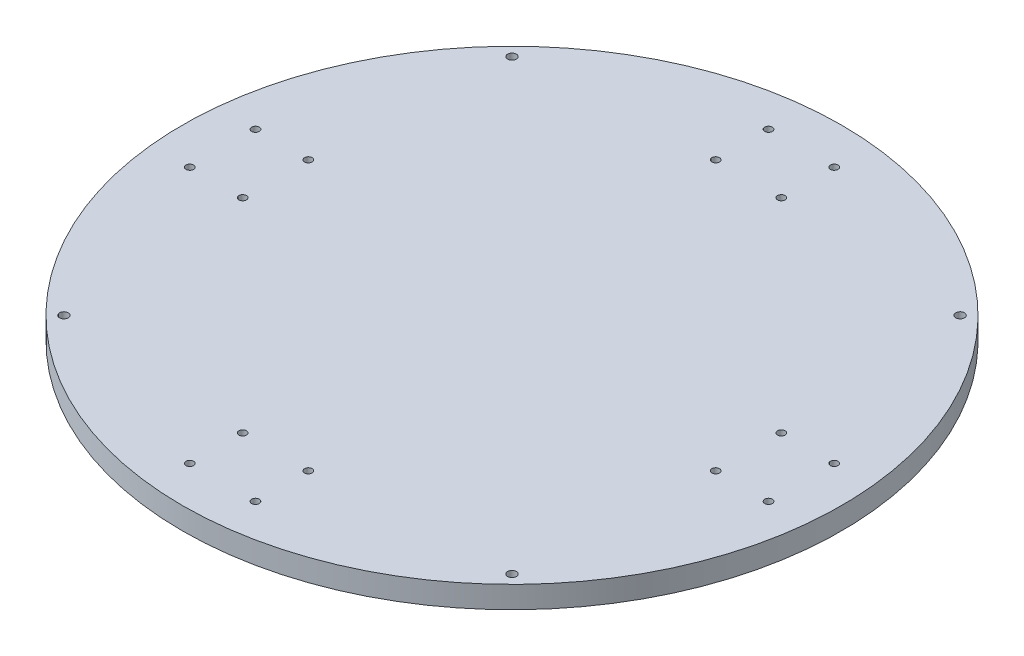
ISO-10303-21;
HEADER;
FILE_DESCRIPTION(('STEP AP214'),'2;1');
FILE_NAME('part.step','',(''),(''),'','','');
FILE_SCHEMA(('AUTOMOTIVE_DESIGN { 1 0 10303 214 1 1 1 1 }'));
ENDSEC;
DATA;
#1=APPLICATION_CONTEXT('core data for automotive mechanical design processes');
#2=APPLICATION_PROTOCOL_DEFINITION('international standard','automotive_design',2000,#1);
#3=PRODUCT_CONTEXT('',#1,'mechanical');
#4=PRODUCT('Part','Part','',(#3));
#5=PRODUCT_RELATED_PRODUCT_CATEGORY('part','',(#4));
#6=PRODUCT_DEFINITION_FORMATION('','',#4);
#7=PRODUCT_DEFINITION_CONTEXT('part definition',#1,'design');
#8=PRODUCT_DEFINITION('design','',#6,#7);
#9=PRODUCT_DEFINITION_SHAPE('','',#8);
#10=(LENGTH_UNIT() NAMED_UNIT(*) SI_UNIT(.MILLI.,.METRE.));
#11=(NAMED_UNIT(*) PLANE_ANGLE_UNIT() SI_UNIT($,.RADIAN.));
#12=(NAMED_UNIT(*) SI_UNIT($,.STERADIAN.) SOLID_ANGLE_UNIT());
#13=UNCERTAINTY_MEASURE_WITH_UNIT(LENGTH_MEASURE(1.E-05),#10,'distance_accuracy_value','');
#14=(GEOMETRIC_REPRESENTATION_CONTEXT(3) GLOBAL_UNCERTAINTY_ASSIGNED_CONTEXT((#13)) GLOBAL_UNIT_ASSIGNED_CONTEXT((#10,
#11,#12)) REPRESENTATION_CONTEXT('',''));
#15=CARTESIAN_POINT('',(0.,0.,0.));
#16=DIRECTION('',(0.,0.,1.));
#17=DIRECTION('',(1.,0.,0.));
#18=AXIS2_PLACEMENT_3D('',#15,#16,#17);
#19=CARTESIAN_POINT('',(0.,10.,0.));
#20=DIRECTION('',(0.,-1.,0.));
#21=DIRECTION('',(0.,0.,-1.));
#22=AXIS2_PLACEMENT_3D('',#19,#20,#21);
#23=CYLINDRICAL_SURFACE('',#22,150.);
#24=CARTESIAN_POINT('',(0.,10.,0.));
#25=DIRECTION('',(0.,1.,0.));
#26=DIRECTION('',(0.,0.,1.));
#27=AXIS2_PLACEMENT_3D('',#24,#25,#26);
#28=CIRCLE('',#27,150.);
#29=CARTESIAN_POINT('',(0.,10.,150.));
#30=VERTEX_POINT('',#29);
#31=EDGE_CURVE('E10',#30,#30,#28,.T.);
#32=ORIENTED_EDGE('',*,*,#31,.F.);
#33=EDGE_LOOP('',(#32));
#34=FACE_BOUND('',#33,.T.);
#35=CARTESIAN_POINT('',(0.,0.,0.));
#36=DIRECTION('',(0.,1.,0.));
#37=DIRECTION('',(0.,0.,1.));
#38=AXIS2_PLACEMENT_3D('',#35,#36,#37);
#39=CIRCLE('',#38,150.);
#40=CARTESIAN_POINT('',(0.,0.,150.));
#41=VERTEX_POINT('',#40);
#42=EDGE_CURVE('E44',#41,#41,#39,.T.);
#43=ORIENTED_EDGE('',*,*,#42,.T.);
#44=EDGE_LOOP('',(#43));
#45=FACE_BOUND('',#44,.T.);
#46=ADVANCED_FACE('F41',(#34,#45),#23,.T.);
#47=CARTESIAN_POINT('',(0.,10.,0.));
#48=DIRECTION('',(0.,1.,0.));
#49=DIRECTION('',(0.,0.,1.));
#50=AXIS2_PLACEMENT_3D('',#47,#48,#49);
#51=PLANE('',#50);
#52=CARTESIAN_POINT('',(-131.706442493367,10.,-14.9449999999864));
#53=DIRECTION('',(0.,1.,0.));
#54=DIRECTION('',(0.,0.,-1.));
#55=AXIS2_PLACEMENT_3D('',#52,#53,#54);
#56=CIRCLE('',#55,1.72999999999047);
#57=CARTESIAN_POINT('',(-131.706442493367,10.,-16.6749999999769));
#58=VERTEX_POINT('',#57);
#59=EDGE_CURVE('E131',#58,#58,#56,.T.);
#60=ORIENTED_EDGE('',*,*,#59,.F.);
#61=EDGE_LOOP('',(#60));
#62=FACE_BOUND('',#61,.T.);
#63=CARTESIAN_POINT('',(-107.646442493367,10.,-14.9449999999864));
#64=DIRECTION('',(0.,1.,0.));
#65=DIRECTION('',(0.,0.,-1.));
#66=AXIS2_PLACEMENT_3D('',#63,#64,#65);
#67=CIRCLE('',#66,1.72999999999054);
#68=CARTESIAN_POINT('',(-107.646442493367,10.,-16.674999999977));
#69=VERTEX_POINT('',#68);
#70=EDGE_CURVE('E140',#69,#69,#67,.T.);
#71=ORIENTED_EDGE('',*,*,#70,.F.);
#72=EDGE_LOOP('',(#71));
#73=FACE_BOUND('',#72,.T.);
#74=CARTESIAN_POINT('',(-107.646442493367,10.,14.9450000000136));
#75=DIRECTION('',(0.,1.,0.));
#76=DIRECTION('',(0.,0.,1.));
#77=AXIS2_PLACEMENT_3D('',#74,#75,#76);
#78=CIRCLE('',#77,1.73000000001802);
#79=CARTESIAN_POINT('',(-107.646442493367,10.,16.6750000000316));
#80=VERTEX_POINT('',#79);
#81=EDGE_CURVE('E148',#80,#80,#78,.T.);
#82=ORIENTED_EDGE('',*,*,#81,.F.);
#83=EDGE_LOOP('',(#82));
#84=FACE_BOUND('',#83,.T.);
#85=CARTESIAN_POINT('',(-131.706442493367,10.,14.9450000000136));
#86=DIRECTION('',(0.,1.,0.));
#87=DIRECTION('',(0.,0.,1.));
#88=AXIS2_PLACEMENT_3D('',#85,#86,#87);
#89=CIRCLE('',#88,1.73000000001826);
#90=CARTESIAN_POINT('',(-131.706442493367,10.,16.6750000000318));
#91=VERTEX_POINT('',#90);
#92=EDGE_CURVE('E156',#91,#91,#89,.T.);
#93=ORIENTED_EDGE('',*,*,#92,.F.);
#94=EDGE_LOOP('',(#93));
#95=FACE_BOUND('',#94,.T.);
#96=CARTESIAN_POINT('',(-14.9449999999731,10.,131.706442493381));
#97=DIRECTION('',(0.,1.,0.));
#98=DIRECTION('',(0.,0.,-1.));
#99=AXIS2_PLACEMENT_3D('',#96,#97,#98);
#100=CIRCLE('',#99,1.72999999997418);
#101=CARTESIAN_POINT('',(-14.9449999999731,10.,129.976442493407));
#102=VERTEX_POINT('',#101);
#103=EDGE_CURVE('E164',#102,#102,#100,.T.);
#104=ORIENTED_EDGE('',*,*,#103,.F.);
#105=EDGE_LOOP('',(#104));
#106=FACE_BOUND('',#105,.T.);
#107=CARTESIAN_POINT('',(-14.9449999999731,10.,107.646442493381));
#108=DIRECTION('',(0.,1.,0.));
#109=DIRECTION('',(0.,0.,-1.));
#110=AXIS2_PLACEMENT_3D('',#107,#108,#109);
#111=CIRCLE('',#110,1.72999999997417);
#112=CARTESIAN_POINT('',(-14.9449999999731,10.,105.916442493407));
#113=VERTEX_POINT('',#112);
#114=EDGE_CURVE('E172',#113,#113,#111,.T.);
#115=ORIENTED_EDGE('',*,*,#114,.F.);
#116=EDGE_LOOP('',(#115));
#117=FACE_BOUND('',#116,.T.);
#118=CARTESIAN_POINT('',(14.9450000000269,10.,107.646442493381));
#119=DIRECTION('',(0.,1.,0.));
#120=DIRECTION('',(0.,0.,1.));
#121=AXIS2_PLACEMENT_3D('',#118,#119,#120);
#122=CIRCLE('',#121,1.73000000002645);
#123=CARTESIAN_POINT('',(14.9450000000269,10.,109.376442493407));
#124=VERTEX_POINT('',#123);
#125=EDGE_CURVE('E180',#124,#124,#122,.T.);
#126=ORIENTED_EDGE('',*,*,#125,.F.);
#127=EDGE_LOOP('',(#126));
#128=FACE_BOUND('',#127,.T.);
#129=CARTESIAN_POINT('',(14.9450000000269,10.,131.706442493381));
#130=DIRECTION('',(0.,1.,0.));
#131=DIRECTION('',(0.,0.,1.));
#132=AXIS2_PLACEMENT_3D('',#129,#130,#131);
#133=CIRCLE('',#132,1.73000000002661);
#134=CARTESIAN_POINT('',(14.9450000000269,10.,133.436442493407));
#135=VERTEX_POINT('',#134);
#136=EDGE_CURVE('E68',#135,#135,#133,.T.);
#137=ORIENTED_EDGE('',*,*,#136,.F.);
#138=EDGE_LOOP('',(#137));
#139=FACE_BOUND('',#138,.T.);
#140=CARTESIAN_POINT('',(131.706442493394,10.,14.9449999999866));
#141=DIRECTION('',(0.,1.,0.));
#142=DIRECTION('',(0.,0.,-1.));
#143=AXIS2_PLACEMENT_3D('',#140,#141,#142);
#144=CIRCLE('',#143,1.7299999999837);
#145=CARTESIAN_POINT('',(131.706442493394,10.,13.2150000000029));
#146=VERTEX_POINT('',#145);
#147=EDGE_CURVE('E67',#146,#146,#144,.T.);
#148=ORIENTED_EDGE('',*,*,#147,.F.);
#149=EDGE_LOOP('',(#148));
#150=FACE_BOUND('',#149,.T.);
#151=CARTESIAN_POINT('',(107.646442493394,10.,14.9449999999866));
#152=DIRECTION('',(0.,1.,0.));
#153=DIRECTION('',(0.,0.,-1.));
#154=AXIS2_PLACEMENT_3D('',#151,#152,#153);
#155=CIRCLE('',#154,1.72999999998362);
#156=CARTESIAN_POINT('',(107.646442493394,10.,13.215000000003));
#157=VERTEX_POINT('',#156);
#158=EDGE_CURVE('E76',#157,#157,#155,.T.);
#159=ORIENTED_EDGE('',*,*,#158,.F.);
#160=EDGE_LOOP('',(#159));
#161=FACE_BOUND('',#160,.T.);
#162=CARTESIAN_POINT('',(107.646442493394,10.,-14.9450000000134));
#163=DIRECTION('',(0.,1.,0.));
#164=DIRECTION('',(0.,0.,1.));
#165=AXIS2_PLACEMENT_3D('',#162,#163,#164);
#166=CIRCLE('',#165,1.73000000000919);
#167=CARTESIAN_POINT('',(107.646442493394,10.,-13.2150000000042));
#168=VERTEX_POINT('',#167);
#169=EDGE_CURVE('E84',#168,#168,#166,.T.);
#170=ORIENTED_EDGE('',*,*,#169,.F.);
#171=EDGE_LOOP('',(#170));
#172=FACE_BOUND('',#171,.T.);
#173=CARTESIAN_POINT('',(131.706442493394,10.,-14.9450000000134));
#174=DIRECTION('',(0.,1.,0.));
#175=DIRECTION('',(0.,0.,1.));
#176=AXIS2_PLACEMENT_3D('',#173,#174,#175);
#177=CIRCLE('',#176,1.73000000000928);
#178=CARTESIAN_POINT('',(131.706442493394,10.,-13.2150000000041));
#179=VERTEX_POINT('',#178);
#180=EDGE_CURVE('E92',#179,#179,#177,.T.);
#181=ORIENTED_EDGE('',*,*,#180,.F.);
#182=EDGE_LOOP('',(#181));
#183=FACE_BOUND('',#182,.T.);
#184=CARTESIAN_POINT('',(-14.945,10.,-107.646442493381));
#185=DIRECTION('',(0.,1.,0.));
#186=DIRECTION('',(0.,0.,1.));
#187=AXIS2_PLACEMENT_3D('',#184,#185,#186);
#188=CIRCLE('',#187,1.73);
#189=CARTESIAN_POINT('',(-14.945,10.,-105.916442493381));
#190=VERTEX_POINT('',#189);
#191=EDGE_CURVE('E59',#190,#190,#188,.T.);
#192=ORIENTED_EDGE('',*,*,#191,.F.);
#193=EDGE_LOOP('',(#192));
#194=FACE_BOUND('',#193,.T.);
#195=CARTESIAN_POINT('',(14.9449999999993,10.,-107.646442493381));
#196=DIRECTION('',(0.,1.,0.));
#197=DIRECTION('',(0.,0.,-1.));
#198=AXIS2_PLACEMENT_3D('',#195,#196,#197);
#199=CIRCLE('',#198,1.73);
#200=CARTESIAN_POINT('',(14.9449999999993,10.,-109.376442493381));
#201=VERTEX_POINT('',#200);
#202=EDGE_CURVE('E101',#201,#201,#199,.T.);
#203=ORIENTED_EDGE('',*,*,#202,.F.);
#204=EDGE_LOOP('',(#203));
#205=FACE_BOUND('',#204,.T.);
#206=CARTESIAN_POINT('',(14.9449999999991,10.,-131.706442493381));
#207=DIRECTION('',(0.,1.,0.));
#208=DIRECTION('',(0.,0.,-1.));
#209=AXIS2_PLACEMENT_3D('',#206,#207,#208);
#210=CIRCLE('',#209,1.73000000000001);
#211=CARTESIAN_POINT('',(14.9449999999991,10.,-133.436442493381));
#212=VERTEX_POINT('',#211);
#213=EDGE_CURVE('E102',#212,#212,#210,.T.);
#214=ORIENTED_EDGE('',*,*,#213,.F.);
#215=EDGE_LOOP('',(#214));
#216=FACE_BOUND('',#215,.T.);
#217=CARTESIAN_POINT('',(101.974532959341,10.,-101.974532959341));
#218=DIRECTION('',(0.,1.,0.));
#219=DIRECTION('',(0.,0.,1.));
#220=AXIS2_PLACEMENT_3D('',#217,#218,#219);
#221=CIRCLE('',#220,2.);
#222=CARTESIAN_POINT('',(101.974532959341,10.,-99.9745329593409));
#223=VERTEX_POINT('',#222);
#224=EDGE_CURVE('E116',#223,#223,#221,.T.);
#225=ORIENTED_EDGE('',*,*,#224,.F.);
#226=EDGE_LOOP('',(#225));
#227=FACE_BOUND('',#226,.T.);
#228=CARTESIAN_POINT('',(101.974532959352,10.,101.974532959341));
#229=DIRECTION('',(0.,1.,0.));
#230=DIRECTION('',(0.,0.,1.));
#231=AXIS2_PLACEMENT_3D('',#228,#229,#230);
#232=CIRCLE('',#231,1.99999999999681);
#233=CARTESIAN_POINT('',(101.974532959352,10.,103.974532959338));
#234=VERTEX_POINT('',#233);
#235=EDGE_CURVE('E132',#234,#234,#232,.T.);
#236=ORIENTED_EDGE('',*,*,#235,.F.);
#237=EDGE_LOOP('',(#236));
#238=FACE_BOUND('',#237,.T.);
#239=CARTESIAN_POINT('',(-101.974532959329,10.,101.974532959352));
#240=DIRECTION('',(0.,1.,0.));
#241=DIRECTION('',(0.,0.,1.));
#242=AXIS2_PLACEMENT_3D('',#239,#240,#241);
#243=CIRCLE('',#242,2.00000000000792);
#244=CARTESIAN_POINT('',(-101.974532959329,10.,103.97453295936));
#245=VERTEX_POINT('',#244);
#246=EDGE_CURVE('E203',#245,#245,#243,.T.);
#247=ORIENTED_EDGE('',*,*,#246,.F.);
#248=EDGE_LOOP('',(#247));
#249=FACE_BOUND('',#248,.T.);
#250=CARTESIAN_POINT('',(-101.974532959341,10.,-101.974532959329));
#251=DIRECTION('',(0.,1.,0.));
#252=DIRECTION('',(0.,0.,1.));
#253=AXIS2_PLACEMENT_3D('',#250,#251,#252);
#254=CIRCLE('',#253,2.00000000001144);
#255=CARTESIAN_POINT('',(-101.974532959341,10.,-99.974532959318));
#256=VERTEX_POINT('',#255);
#257=EDGE_CURVE('E195',#256,#256,#254,.T.);
#258=ORIENTED_EDGE('',*,*,#257,.F.);
#259=EDGE_LOOP('',(#258));
#260=FACE_BOUND('',#259,.T.);
#261=CARTESIAN_POINT('',(-14.945,10.,-131.706442493381));
#262=DIRECTION('',(0.,1.,0.));
#263=DIRECTION('',(0.,0.,1.));
#264=AXIS2_PLACEMENT_3D('',#261,#262,#263);
#265=CIRCLE('',#264,1.73);
#266=CARTESIAN_POINT('',(-14.945,10.,-129.97644249338));
#267=VERTEX_POINT('',#266);
#268=EDGE_CURVE('E55',#267,#267,#265,.T.);
#269=ORIENTED_EDGE('',*,*,#268,.F.);
#270=EDGE_LOOP('',(#269));
#271=FACE_BOUND('',#270,.T.);
#272=ORIENTED_EDGE('',*,*,#31,.T.);
#273=EDGE_LOOP('',(#272));
#274=FACE_BOUND('',#273,.T.);
#275=ADVANCED_FACE('F217',(#62,#73,#84,#95,#106,#117,#128,#139,#150,#161,#172,#183,#194,#205,
#216,#227,#238,#249,#260,#271,#274),#51,.T.);
#276=CARTESIAN_POINT('',(0.,0.,0.));
#277=DIRECTION('',(0.,1.,0.));
#278=DIRECTION('',(0.,0.,1.));
#279=AXIS2_PLACEMENT_3D('',#276,#277,#278);
#280=PLANE('',#279);
#281=CARTESIAN_POINT('',(-131.706442493367,0.,-14.9449999999864));
#282=DIRECTION('',(0.,1.,0.));
#283=DIRECTION('',(0.,0.,-1.));
#284=AXIS2_PLACEMENT_3D('',#281,#282,#283);
#285=CIRCLE('',#284,1.72999999999047);
#286=CARTESIAN_POINT('',(-131.706442493367,0.,-16.6749999999769));
#287=VERTEX_POINT('',#286);
#288=EDGE_CURVE('E127',#287,#287,#285,.T.);
#289=ORIENTED_EDGE('',*,*,#288,.T.);
#290=EDGE_LOOP('',(#289));
#291=FACE_BOUND('',#290,.T.);
#292=CARTESIAN_POINT('',(-107.646442493367,0.,-14.9449999999864));
#293=DIRECTION('',(0.,1.,0.));
#294=DIRECTION('',(0.,0.,-1.));
#295=AXIS2_PLACEMENT_3D('',#292,#293,#294);
#296=CIRCLE('',#295,1.72999999999054);
#297=CARTESIAN_POINT('',(-107.646442493367,0.,-16.674999999977));
#298=VERTEX_POINT('',#297);
#299=EDGE_CURVE('E136',#298,#298,#296,.T.);
#300=ORIENTED_EDGE('',*,*,#299,.T.);
#301=EDGE_LOOP('',(#300));
#302=FACE_BOUND('',#301,.T.);
#303=CARTESIAN_POINT('',(-107.646442493367,0.,14.9450000000136));
#304=DIRECTION('',(0.,1.,0.));
#305=DIRECTION('',(0.,0.,1.));
#306=AXIS2_PLACEMENT_3D('',#303,#304,#305);
#307=CIRCLE('',#306,1.73000000001802);
#308=CARTESIAN_POINT('',(-107.646442493367,0.,16.6750000000316));
#309=VERTEX_POINT('',#308);
#310=EDGE_CURVE('E144',#309,#309,#307,.T.);
#311=ORIENTED_EDGE('',*,*,#310,.T.);
#312=EDGE_LOOP('',(#311));
#313=FACE_BOUND('',#312,.T.);
#314=CARTESIAN_POINT('',(-131.706442493367,0.,14.9450000000136));
#315=DIRECTION('',(0.,1.,0.));
#316=DIRECTION('',(0.,0.,1.));
#317=AXIS2_PLACEMENT_3D('',#314,#315,#316);
#318=CIRCLE('',#317,1.73000000001826);
#319=CARTESIAN_POINT('',(-131.706442493367,0.,16.6750000000318));
#320=VERTEX_POINT('',#319);
#321=EDGE_CURVE('E152',#320,#320,#318,.T.);
#322=ORIENTED_EDGE('',*,*,#321,.T.);
#323=EDGE_LOOP('',(#322));
#324=FACE_BOUND('',#323,.T.);
#325=CARTESIAN_POINT('',(-14.9449999999731,0.,131.706442493381));
#326=DIRECTION('',(0.,1.,0.));
#327=DIRECTION('',(0.,0.,-1.));
#328=AXIS2_PLACEMENT_3D('',#325,#326,#327);
#329=CIRCLE('',#328,1.72999999997418);
#330=CARTESIAN_POINT('',(-14.9449999999731,0.,129.976442493407));
#331=VERTEX_POINT('',#330);
#332=EDGE_CURVE('E160',#331,#331,#329,.T.);
#333=ORIENTED_EDGE('',*,*,#332,.T.);
#334=EDGE_LOOP('',(#333));
#335=FACE_BOUND('',#334,.T.);
#336=CARTESIAN_POINT('',(-14.9449999999731,0.,107.646442493381));
#337=DIRECTION('',(0.,1.,0.));
#338=DIRECTION('',(0.,0.,-1.));
#339=AXIS2_PLACEMENT_3D('',#336,#337,#338);
#340=CIRCLE('',#339,1.72999999997417);
#341=CARTESIAN_POINT('',(-14.9449999999731,0.,105.916442493407));
#342=VERTEX_POINT('',#341);
#343=EDGE_CURVE('E168',#342,#342,#340,.T.);
#344=ORIENTED_EDGE('',*,*,#343,.T.);
#345=EDGE_LOOP('',(#344));
#346=FACE_BOUND('',#345,.T.);
#347=CARTESIAN_POINT('',(14.9450000000269,0.,107.646442493381));
#348=DIRECTION('',(0.,1.,0.));
#349=DIRECTION('',(0.,0.,1.));
#350=AXIS2_PLACEMENT_3D('',#347,#348,#349);
#351=CIRCLE('',#350,1.73000000002645);
#352=CARTESIAN_POINT('',(14.9450000000269,0.,109.376442493407));
#353=VERTEX_POINT('',#352);
#354=EDGE_CURVE('E176',#353,#353,#351,.T.);
#355=ORIENTED_EDGE('',*,*,#354,.T.);
#356=EDGE_LOOP('',(#355));
#357=FACE_BOUND('',#356,.T.);
#358=CARTESIAN_POINT('',(14.9450000000269,0.,131.706442493381));
#359=DIRECTION('',(0.,1.,0.));
#360=DIRECTION('',(0.,0.,1.));
#361=AXIS2_PLACEMENT_3D('',#358,#359,#360);
#362=CIRCLE('',#361,1.73000000002661);
#363=CARTESIAN_POINT('',(14.9450000000269,0.,133.436442493407));
#364=VERTEX_POINT('',#363);
#365=EDGE_CURVE('E184',#364,#364,#362,.T.);
#366=ORIENTED_EDGE('',*,*,#365,.T.);
#367=EDGE_LOOP('',(#366));
#368=FACE_BOUND('',#367,.T.);
#369=CARTESIAN_POINT('',(131.706442493394,0.,14.9449999999866));
#370=DIRECTION('',(0.,1.,0.));
#371=DIRECTION('',(0.,0.,-1.));
#372=AXIS2_PLACEMENT_3D('',#369,#370,#371);
#373=CIRCLE('',#372,1.7299999999837);
#374=CARTESIAN_POINT('',(131.706442493394,0.,13.2150000000029));
#375=VERTEX_POINT('',#374);
#376=EDGE_CURVE('E63',#375,#375,#373,.T.);
#377=ORIENTED_EDGE('',*,*,#376,.T.);
#378=EDGE_LOOP('',(#377));
#379=FACE_BOUND('',#378,.T.);
#380=CARTESIAN_POINT('',(107.646442493394,0.,14.9449999999866));
#381=DIRECTION('',(0.,1.,0.));
#382=DIRECTION('',(0.,0.,-1.));
#383=AXIS2_PLACEMENT_3D('',#380,#381,#382);
#384=CIRCLE('',#383,1.72999999998362);
#385=CARTESIAN_POINT('',(107.646442493394,0.,13.215000000003));
#386=VERTEX_POINT('',#385);
#387=EDGE_CURVE('E72',#386,#386,#384,.T.);
#388=ORIENTED_EDGE('',*,*,#387,.T.);
#389=EDGE_LOOP('',(#388));
#390=FACE_BOUND('',#389,.T.);
#391=CARTESIAN_POINT('',(107.646442493394,0.,-14.9450000000134));
#392=DIRECTION('',(0.,1.,0.));
#393=DIRECTION('',(0.,0.,1.));
#394=AXIS2_PLACEMENT_3D('',#391,#392,#393);
#395=CIRCLE('',#394,1.73000000000919);
#396=CARTESIAN_POINT('',(107.646442493394,0.,-13.2150000000042));
#397=VERTEX_POINT('',#396);
#398=EDGE_CURVE('E80',#397,#397,#395,.T.);
#399=ORIENTED_EDGE('',*,*,#398,.T.);
#400=EDGE_LOOP('',(#399));
#401=FACE_BOUND('',#400,.T.);
#402=CARTESIAN_POINT('',(131.706442493394,0.,-14.9450000000134));
#403=DIRECTION('',(0.,1.,0.));
#404=DIRECTION('',(0.,0.,1.));
#405=AXIS2_PLACEMENT_3D('',#402,#403,#404);
#406=CIRCLE('',#405,1.73000000000928);
#407=CARTESIAN_POINT('',(131.706442493394,0.,-13.2150000000041));
#408=VERTEX_POINT('',#407);
#409=EDGE_CURVE('E88',#408,#408,#406,.T.);
#410=ORIENTED_EDGE('',*,*,#409,.T.);
#411=EDGE_LOOP('',(#410));
#412=FACE_BOUND('',#411,.T.);
#413=CARTESIAN_POINT('',(-14.945,0.,-107.646442493381));
#414=DIRECTION('',(0.,1.,0.));
#415=DIRECTION('',(0.,0.,1.));
#416=AXIS2_PLACEMENT_3D('',#413,#414,#415);
#417=CIRCLE('',#416,1.73);
#418=CARTESIAN_POINT('',(-14.945,0.,-105.916442493381));
#419=VERTEX_POINT('',#418);
#420=EDGE_CURVE('E106',#419,#419,#417,.T.);
#421=ORIENTED_EDGE('',*,*,#420,.T.);
#422=EDGE_LOOP('',(#421));
#423=FACE_BOUND('',#422,.T.);
#424=CARTESIAN_POINT('',(14.9449999999993,0.,-107.646442493381));
#425=DIRECTION('',(0.,1.,0.));
#426=DIRECTION('',(0.,0.,-1.));
#427=AXIS2_PLACEMENT_3D('',#424,#425,#426);
#428=CIRCLE('',#427,1.73);
#429=CARTESIAN_POINT('',(14.9449999999993,0.,-109.376442493381));
#430=VERTEX_POINT('',#429);
#431=EDGE_CURVE('E97',#430,#430,#428,.T.);
#432=ORIENTED_EDGE('',*,*,#431,.T.);
#433=EDGE_LOOP('',(#432));
#434=FACE_BOUND('',#433,.T.);
#435=CARTESIAN_POINT('',(14.9449999999991,0.,-131.706442493381));
#436=DIRECTION('',(0.,1.,0.));
#437=DIRECTION('',(0.,0.,-1.));
#438=AXIS2_PLACEMENT_3D('',#435,#436,#437);
#439=CIRCLE('',#438,1.73000000000001);
#440=CARTESIAN_POINT('',(14.9449999999991,0.,-133.436442493381));
#441=VERTEX_POINT('',#440);
#442=EDGE_CURVE('E120',#441,#441,#439,.T.);
#443=ORIENTED_EDGE('',*,*,#442,.T.);
#444=EDGE_LOOP('',(#443));
#445=FACE_BOUND('',#444,.T.);
#446=CARTESIAN_POINT('',(101.974532959341,0.,-101.974532959341));
#447=DIRECTION('',(0.,1.,0.));
#448=DIRECTION('',(0.,0.,1.));
#449=AXIS2_PLACEMENT_3D('',#446,#447,#448);
#450=CIRCLE('',#449,2.);
#451=CARTESIAN_POINT('',(101.974532959341,0.,-99.9745329593409));
#452=VERTEX_POINT('',#451);
#453=EDGE_CURVE('E96',#452,#452,#450,.T.);
#454=ORIENTED_EDGE('',*,*,#453,.T.);
#455=EDGE_LOOP('',(#454));
#456=FACE_BOUND('',#455,.T.);
#457=CARTESIAN_POINT('',(101.974532959352,0.,101.974532959341));
#458=DIRECTION('',(0.,1.,0.));
#459=DIRECTION('',(0.,0.,1.));
#460=AXIS2_PLACEMENT_3D('',#457,#458,#459);
#461=CIRCLE('',#460,1.99999999999681);
#462=CARTESIAN_POINT('',(101.974532959352,0.,103.974532959338));
#463=VERTEX_POINT('',#462);
#464=EDGE_CURVE('E207',#463,#463,#461,.T.);
#465=ORIENTED_EDGE('',*,*,#464,.T.);
#466=EDGE_LOOP('',(#465));
#467=FACE_BOUND('',#466,.T.);
#468=CARTESIAN_POINT('',(-101.974532959329,0.,101.974532959352));
#469=DIRECTION('',(0.,1.,0.));
#470=DIRECTION('',(0.,0.,1.));
#471=AXIS2_PLACEMENT_3D('',#468,#469,#470);
#472=CIRCLE('',#471,2.00000000000792);
#473=CARTESIAN_POINT('',(-101.974532959329,0.,103.97453295936));
#474=VERTEX_POINT('',#473);
#475=EDGE_CURVE('E199',#474,#474,#472,.T.);
#476=ORIENTED_EDGE('',*,*,#475,.T.);
#477=EDGE_LOOP('',(#476));
#478=FACE_BOUND('',#477,.T.);
#479=CARTESIAN_POINT('',(-101.974532959341,0.,-101.974532959329));
#480=DIRECTION('',(0.,1.,0.));
#481=DIRECTION('',(0.,0.,1.));
#482=AXIS2_PLACEMENT_3D('',#479,#480,#481);
#483=CIRCLE('',#482,2.00000000001144);
#484=CARTESIAN_POINT('',(-101.974532959341,0.,-99.974532959318));
#485=VERTEX_POINT('',#484);
#486=EDGE_CURVE('E191',#485,#485,#483,.T.);
#487=ORIENTED_EDGE('',*,*,#486,.T.);
#488=EDGE_LOOP('',(#487));
#489=FACE_BOUND('',#488,.T.);
#490=CARTESIAN_POINT('',(-14.945,0.,-131.706442493381));
#491=DIRECTION('',(0.,1.,0.));
#492=DIRECTION('',(0.,0.,1.));
#493=AXIS2_PLACEMENT_3D('',#490,#491,#492);
#494=CIRCLE('',#493,1.73);
#495=CARTESIAN_POINT('',(-14.945,0.,-129.97644249338));
#496=VERTEX_POINT('',#495);
#497=EDGE_CURVE('E53',#496,#496,#494,.T.);
#498=ORIENTED_EDGE('',*,*,#497,.T.);
#499=EDGE_LOOP('',(#498));
#500=FACE_BOUND('',#499,.T.);
#501=ORIENTED_EDGE('',*,*,#42,.F.);
#502=EDGE_LOOP('',(#501));
#503=FACE_BOUND('',#502,.T.);
#504=ADVANCED_FACE('F220',(#291,#302,#313,#324,#335,#346,#357,#368,#379,#390,#401,#412,#423,
#434,#445,#456,#467,#478,#489,#500,#503),#280,.F.);
#505=CARTESIAN_POINT('',(-14.945,0.,-131.706442493381));
#506=DIRECTION('',(0.,1.,0.));
#507=DIRECTION('',(0.,0.,1.));
#508=AXIS2_PLACEMENT_3D('',#505,#506,#507);
#509=CYLINDRICAL_SURFACE('',#508,1.73);
#510=ORIENTED_EDGE('',*,*,#497,.F.);
#511=EDGE_LOOP('',(#510));
#512=FACE_BOUND('',#511,.T.);
#513=ORIENTED_EDGE('',*,*,#268,.T.);
#514=EDGE_LOOP('',(#513));
#515=FACE_BOUND('',#514,.T.);
#516=ADVANCED_FACE('F229',(#512,#515),#509,.F.);
#517=CARTESIAN_POINT('',(-101.974532959341,0.,-101.974532959329));
#518=DIRECTION('',(0.,1.,0.));
#519=DIRECTION('',(0.,0.,1.));
#520=AXIS2_PLACEMENT_3D('',#517,#518,#519);
#521=CYLINDRICAL_SURFACE('',#520,2.00000000001144);
#522=ORIENTED_EDGE('',*,*,#486,.F.);
#523=EDGE_LOOP('',(#522));
#524=FACE_BOUND('',#523,.T.);
#525=ORIENTED_EDGE('',*,*,#257,.T.);
#526=EDGE_LOOP('',(#525));
#527=FACE_BOUND('',#526,.T.);
#528=ADVANCED_FACE('F231',(#524,#527),#521,.F.);
#529=CARTESIAN_POINT('',(-101.974532959329,0.,101.974532959352));
#530=DIRECTION('',(0.,1.,0.));
#531=DIRECTION('',(0.,0.,1.));
#532=AXIS2_PLACEMENT_3D('',#529,#530,#531);
#533=CYLINDRICAL_SURFACE('',#532,2.00000000000792);
#534=ORIENTED_EDGE('',*,*,#475,.F.);
#535=EDGE_LOOP('',(#534));
#536=FACE_BOUND('',#535,.T.);
#537=ORIENTED_EDGE('',*,*,#246,.T.);
#538=EDGE_LOOP('',(#537));
#539=FACE_BOUND('',#538,.T.);
#540=ADVANCED_FACE('F238',(#536,#539),#533,.F.);
#541=CARTESIAN_POINT('',(101.974532959352,0.,101.974532959341));
#542=DIRECTION('',(0.,1.,0.));
#543=DIRECTION('',(0.,0.,1.));
#544=AXIS2_PLACEMENT_3D('',#541,#542,#543);
#545=CYLINDRICAL_SURFACE('',#544,1.99999999999681);
#546=ORIENTED_EDGE('',*,*,#464,.F.);
#547=EDGE_LOOP('',(#546));
#548=FACE_BOUND('',#547,.T.);
#549=ORIENTED_EDGE('',*,*,#235,.T.);
#550=EDGE_LOOP('',(#549));
#551=FACE_BOUND('',#550,.T.);
#552=ADVANCED_FACE('F215',(#548,#551),#545,.F.);
#553=CARTESIAN_POINT('',(101.974532959341,0.,-101.974532959341));
#554=DIRECTION('',(0.,1.,0.));
#555=DIRECTION('',(0.,0.,1.));
#556=AXIS2_PLACEMENT_3D('',#553,#554,#555);
#557=CYLINDRICAL_SURFACE('',#556,2.);
#558=ORIENTED_EDGE('',*,*,#453,.F.);
#559=EDGE_LOOP('',(#558));
#560=FACE_BOUND('',#559,.T.);
#561=ORIENTED_EDGE('',*,*,#224,.T.);
#562=EDGE_LOOP('',(#561));
#563=FACE_BOUND('',#562,.T.);
#564=ADVANCED_FACE('F291',(#560,#563),#557,.F.);
#565=CARTESIAN_POINT('',(14.9449999999991,0.,-131.706442493381));
#566=DIRECTION('',(0.,1.,0.));
#567=DIRECTION('',(0.,0.,1.));
#568=AXIS2_PLACEMENT_3D('',#565,#566,#567);
#569=CYLINDRICAL_SURFACE('',#568,1.73000000000001);
#570=ORIENTED_EDGE('',*,*,#442,.F.);
#571=EDGE_LOOP('',(#570));
#572=FACE_BOUND('',#571,.T.);
#573=ORIENTED_EDGE('',*,*,#213,.T.);
#574=EDGE_LOOP('',(#573));
#575=FACE_BOUND('',#574,.T.);
#576=ADVANCED_FACE('F302',(#572,#575),#569,.F.);
#577=CARTESIAN_POINT('',(14.9449999999993,0.,-107.646442493381));
#578=DIRECTION('',(0.,1.,0.));
#579=DIRECTION('',(0.,0.,1.));
#580=AXIS2_PLACEMENT_3D('',#577,#578,#579);
#581=CYLINDRICAL_SURFACE('',#580,1.73);
#582=ORIENTED_EDGE('',*,*,#431,.F.);
#583=EDGE_LOOP('',(#582));
#584=FACE_BOUND('',#583,.T.);
#585=ORIENTED_EDGE('',*,*,#202,.T.);
#586=EDGE_LOOP('',(#585));
#587=FACE_BOUND('',#586,.T.);
#588=ADVANCED_FACE('F313',(#584,#587),#581,.F.);
#589=CARTESIAN_POINT('',(-14.945,0.,-107.646442493381));
#590=DIRECTION('',(0.,1.,0.));
#591=DIRECTION('',(0.,0.,1.));
#592=AXIS2_PLACEMENT_3D('',#589,#590,#591);
#593=CYLINDRICAL_SURFACE('',#592,1.73);
#594=ORIENTED_EDGE('',*,*,#420,.F.);
#595=EDGE_LOOP('',(#594));
#596=FACE_BOUND('',#595,.T.);
#597=ORIENTED_EDGE('',*,*,#191,.T.);
#598=EDGE_LOOP('',(#597));
#599=FACE_BOUND('',#598,.T.);
#600=ADVANCED_FACE('F324',(#596,#599),#593,.F.);
#601=CARTESIAN_POINT('',(131.706442493394,0.,-14.9450000000134));
#602=DIRECTION('',(0.,1.,0.));
#603=DIRECTION('',(0.,0.,1.));
#604=AXIS2_PLACEMENT_3D('',#601,#602,#603);
#605=CYLINDRICAL_SURFACE('',#604,1.73000000000928);
#606=ORIENTED_EDGE('',*,*,#409,.F.);
#607=EDGE_LOOP('',(#606));
#608=FACE_BOUND('',#607,.T.);
#609=ORIENTED_EDGE('',*,*,#180,.T.);
#610=EDGE_LOOP('',(#609));
#611=FACE_BOUND('',#610,.T.);
#612=ADVANCED_FACE('F335',(#608,#611),#605,.F.);
#613=CARTESIAN_POINT('',(107.646442493394,0.,-14.9450000000134));
#614=DIRECTION('',(0.,1.,0.));
#615=DIRECTION('',(0.,0.,1.));
#616=AXIS2_PLACEMENT_3D('',#613,#614,#615);
#617=CYLINDRICAL_SURFACE('',#616,1.73000000000919);
#618=ORIENTED_EDGE('',*,*,#398,.F.);
#619=EDGE_LOOP('',(#618));
#620=FACE_BOUND('',#619,.T.);
#621=ORIENTED_EDGE('',*,*,#169,.T.);
#622=EDGE_LOOP('',(#621));
#623=FACE_BOUND('',#622,.T.);
#624=ADVANCED_FACE('F346',(#620,#623),#617,.F.);
#625=CARTESIAN_POINT('',(107.646442493394,0.,14.9449999999866));
#626=DIRECTION('',(0.,1.,0.));
#627=DIRECTION('',(0.,0.,1.));
#628=AXIS2_PLACEMENT_3D('',#625,#626,#627);
#629=CYLINDRICAL_SURFACE('',#628,1.72999999998362);
#630=ORIENTED_EDGE('',*,*,#387,.F.);
#631=EDGE_LOOP('',(#630));
#632=FACE_BOUND('',#631,.T.);
#633=ORIENTED_EDGE('',*,*,#158,.T.);
#634=EDGE_LOOP('',(#633));
#635=FACE_BOUND('',#634,.T.);
#636=ADVANCED_FACE('F357',(#632,#635),#629,.F.);
#637=CARTESIAN_POINT('',(131.706442493394,0.,14.9449999999866));
#638=DIRECTION('',(0.,1.,0.));
#639=DIRECTION('',(0.,0.,1.));
#640=AXIS2_PLACEMENT_3D('',#637,#638,#639);
#641=CYLINDRICAL_SURFACE('',#640,1.7299999999837);
#642=ORIENTED_EDGE('',*,*,#376,.F.);
#643=EDGE_LOOP('',(#642));
#644=FACE_BOUND('',#643,.T.);
#645=ORIENTED_EDGE('',*,*,#147,.T.);
#646=EDGE_LOOP('',(#645));
#647=FACE_BOUND('',#646,.T.);
#648=ADVANCED_FACE('F368',(#644,#647),#641,.F.);
#649=CARTESIAN_POINT('',(14.9450000000269,0.,131.706442493381));
#650=DIRECTION('',(0.,1.,0.));
#651=DIRECTION('',(0.,0.,1.));
#652=AXIS2_PLACEMENT_3D('',#649,#650,#651);
#653=CYLINDRICAL_SURFACE('',#652,1.73000000002661);
#654=ORIENTED_EDGE('',*,*,#365,.F.);
#655=EDGE_LOOP('',(#654));
#656=FACE_BOUND('',#655,.T.);
#657=ORIENTED_EDGE('',*,*,#136,.T.);
#658=EDGE_LOOP('',(#657));
#659=FACE_BOUND('',#658,.T.);
#660=ADVANCED_FACE('F379',(#656,#659),#653,.F.);
#661=CARTESIAN_POINT('',(14.9450000000269,0.,107.646442493381));
#662=DIRECTION('',(0.,1.,0.));
#663=DIRECTION('',(0.,0.,1.));
#664=AXIS2_PLACEMENT_3D('',#661,#662,#663);
#665=CYLINDRICAL_SURFACE('',#664,1.73000000002645);
#666=ORIENTED_EDGE('',*,*,#354,.F.);
#667=EDGE_LOOP('',(#666));
#668=FACE_BOUND('',#667,.T.);
#669=ORIENTED_EDGE('',*,*,#125,.T.);
#670=EDGE_LOOP('',(#669));
#671=FACE_BOUND('',#670,.T.);
#672=ADVANCED_FACE('F389',(#668,#671),#665,.F.);
#673=CARTESIAN_POINT('',(-14.9449999999731,0.,107.646442493381));
#674=DIRECTION('',(0.,1.,0.));
#675=DIRECTION('',(0.,0.,1.));
#676=AXIS2_PLACEMENT_3D('',#673,#674,#675);
#677=CYLINDRICAL_SURFACE('',#676,1.72999999997417);
#678=ORIENTED_EDGE('',*,*,#343,.F.);
#679=EDGE_LOOP('',(#678));
#680=FACE_BOUND('',#679,.T.);
#681=ORIENTED_EDGE('',*,*,#114,.T.);
#682=EDGE_LOOP('',(#681));
#683=FACE_BOUND('',#682,.T.);
#684=ADVANCED_FACE('F400',(#680,#683),#677,.F.);
#685=CARTESIAN_POINT('',(-14.9449999999731,0.,131.706442493381));
#686=DIRECTION('',(0.,1.,0.));
#687=DIRECTION('',(0.,0.,1.));
#688=AXIS2_PLACEMENT_3D('',#685,#686,#687);
#689=CYLINDRICAL_SURFACE('',#688,1.72999999997418);
#690=ORIENTED_EDGE('',*,*,#332,.F.);
#691=EDGE_LOOP('',(#690));
#692=FACE_BOUND('',#691,.T.);
#693=ORIENTED_EDGE('',*,*,#103,.T.);
#694=EDGE_LOOP('',(#693));
#695=FACE_BOUND('',#694,.T.);
#696=ADVANCED_FACE('F411',(#692,#695),#689,.F.);
#697=CARTESIAN_POINT('',(-131.706442493367,0.,14.9450000000136));
#698=DIRECTION('',(0.,1.,0.));
#699=DIRECTION('',(0.,0.,1.));
#700=AXIS2_PLACEMENT_3D('',#697,#698,#699);
#701=CYLINDRICAL_SURFACE('',#700,1.73000000001826);
#702=ORIENTED_EDGE('',*,*,#321,.F.);
#703=EDGE_LOOP('',(#702));
#704=FACE_BOUND('',#703,.T.);
#705=ORIENTED_EDGE('',*,*,#92,.T.);
#706=EDGE_LOOP('',(#705));
#707=FACE_BOUND('',#706,.T.);
#708=ADVANCED_FACE('F422',(#704,#707),#701,.F.);
#709=CARTESIAN_POINT('',(-107.646442493367,0.,14.9450000000136));
#710=DIRECTION('',(0.,1.,0.));
#711=DIRECTION('',(0.,0.,1.));
#712=AXIS2_PLACEMENT_3D('',#709,#710,#711);
#713=CYLINDRICAL_SURFACE('',#712,1.73000000001802);
#714=ORIENTED_EDGE('',*,*,#310,.F.);
#715=EDGE_LOOP('',(#714));
#716=FACE_BOUND('',#715,.T.);
#717=ORIENTED_EDGE('',*,*,#81,.T.);
#718=EDGE_LOOP('',(#717));
#719=FACE_BOUND('',#718,.T.);
#720=ADVANCED_FACE('F433',(#716,#719),#713,.F.);
#721=CARTESIAN_POINT('',(-107.646442493367,0.,-14.9449999999864));
#722=DIRECTION('',(0.,1.,0.));
#723=DIRECTION('',(0.,0.,1.));
#724=AXIS2_PLACEMENT_3D('',#721,#722,#723);
#725=CYLINDRICAL_SURFACE('',#724,1.72999999999054);
#726=ORIENTED_EDGE('',*,*,#299,.F.);
#727=EDGE_LOOP('',(#726));
#728=FACE_BOUND('',#727,.T.);
#729=ORIENTED_EDGE('',*,*,#70,.T.);
#730=EDGE_LOOP('',(#729));
#731=FACE_BOUND('',#730,.T.);
#732=ADVANCED_FACE('F444',(#728,#731),#725,.F.);
#733=CARTESIAN_POINT('',(-131.706442493367,0.,-14.9449999999864));
#734=DIRECTION('',(0.,1.,0.));
#735=DIRECTION('',(0.,0.,1.));
#736=AXIS2_PLACEMENT_3D('',#733,#734,#735);
#737=CYLINDRICAL_SURFACE('',#736,1.72999999999047);
#738=ORIENTED_EDGE('',*,*,#288,.F.);
#739=EDGE_LOOP('',(#738));
#740=FACE_BOUND('',#739,.T.);
#741=ORIENTED_EDGE('',*,*,#59,.T.);
#742=EDGE_LOOP('',(#741));
#743=FACE_BOUND('',#742,.T.);
#744=ADVANCED_FACE('F455',(#740,#743),#737,.F.);
#745=CLOSED_SHELL('',(#46,#275,#504,#516,#528,#540,#552,#564,#576,#588,#600,#612,#624,#636,#648,
#660,#672,#684,#696,#708,#720,#732,#744));
#746=MANIFOLD_SOLID_BREP('B2',#745);
#747=ADVANCED_BREP_SHAPE_REPRESENTATION('',(#18,#746),#14);
#748=SHAPE_DEFINITION_REPRESENTATION(#9,#747);
ENDSEC;
END-ISO-10303-21;
